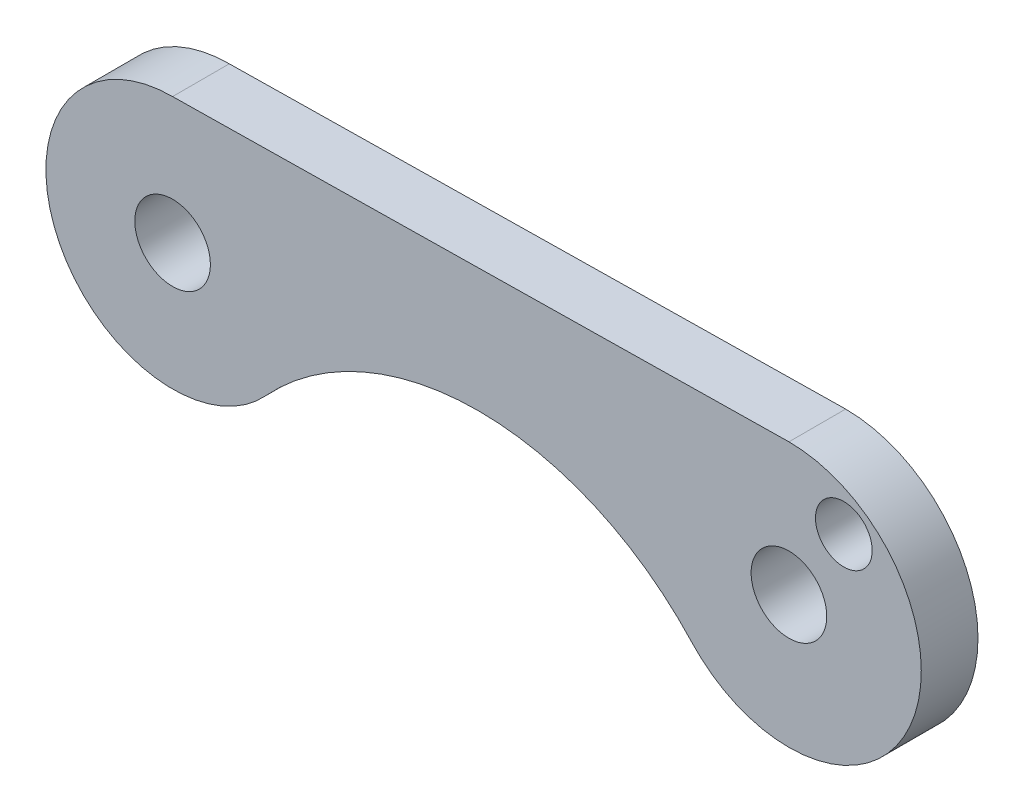
ISO-10303-21;
HEADER;
FILE_DESCRIPTION(('STEP AP214'),'2;1');
FILE_NAME('part.step','',(''),(''),'','','');
FILE_SCHEMA(('AUTOMOTIVE_DESIGN { 1 0 10303 214 1 1 1 1 }'));
ENDSEC;
DATA;
#1=APPLICATION_CONTEXT('core data for automotive mechanical design processes');
#2=APPLICATION_PROTOCOL_DEFINITION('international standard','automotive_design',2000,#1);
#3=PRODUCT_CONTEXT('',#1,'mechanical');
#4=PRODUCT('Part','Part','',(#3));
#5=PRODUCT_RELATED_PRODUCT_CATEGORY('part','',(#4));
#6=PRODUCT_DEFINITION_FORMATION('','',#4);
#7=PRODUCT_DEFINITION_CONTEXT('part definition',#1,'design');
#8=PRODUCT_DEFINITION('design','',#6,#7);
#9=PRODUCT_DEFINITION_SHAPE('','',#8);
#10=(LENGTH_UNIT() NAMED_UNIT(*) SI_UNIT(.MILLI.,.METRE.));
#11=(NAMED_UNIT(*) PLANE_ANGLE_UNIT() SI_UNIT($,.RADIAN.));
#12=(NAMED_UNIT(*) SI_UNIT($,.STERADIAN.) SOLID_ANGLE_UNIT());
#13=UNCERTAINTY_MEASURE_WITH_UNIT(LENGTH_MEASURE(1.E-05),#10,'distance_accuracy_value','');
#14=(GEOMETRIC_REPRESENTATION_CONTEXT(3) GLOBAL_UNCERTAINTY_ASSIGNED_CONTEXT((#13)) GLOBAL_UNIT_ASSIGNED_CONTEXT((#10,
#11,#12)) REPRESENTATION_CONTEXT('',''));
#15=CARTESIAN_POINT('',(0.,0.,0.));
#16=DIRECTION('',(0.,0.,1.));
#17=DIRECTION('',(1.,0.,0.));
#18=AXIS2_PLACEMENT_3D('',#15,#16,#17);
#19=CARTESIAN_POINT('',(-17.4391802539687,-14.8148116586366,3.));
#20=DIRECTION('',(0.,0.,-1.));
#21=DIRECTION('',(-1.,0.,0.));
#22=AXIS2_PLACEMENT_3D('',#19,#20,#21);
#23=CYLINDRICAL_SURFACE('',#22,15.3);
#24=CARTESIAN_POINT('',(-17.4391802539687,-14.8148116586366,0.));
#25=DIRECTION('',(0.,0.,1.));
#26=DIRECTION('',(1.,0.,0.));
#27=AXIS2_PLACEMENT_3D('',#24,#25,#26);
#28=CIRCLE('',#27,15.3);
#29=CARTESIAN_POINT('',(-6.17448324505068,-4.46123250467855,0.));
#30=VERTEX_POINT('',#29);
#31=CARTESIAN_POINT('',(-28.6926919222018,-4.44907602951017,0.));
#32=VERTEX_POINT('',#31);
#33=EDGE_CURVE('E108',#30,#32,#28,.T.);
#34=ORIENTED_EDGE('',*,*,#33,.F.);
#35=DIRECTION('',(0.,0.,-1.));
#36=VECTOR('',#35,1.);
#37=CARTESIAN_POINT('',(-6.17448324505068,-4.46123250467855,3.));
#38=LINE('',#37,#36);
#39=CARTESIAN_POINT('',(-6.17448324505068,-4.46123250467855,3.));
#40=VERTEX_POINT('',#39);
#41=EDGE_CURVE('E11',#40,#30,#38,.T.);
#42=ORIENTED_EDGE('',*,*,#41,.F.);
#43=CARTESIAN_POINT('',(-17.4391802539687,-14.8148116586366,3.));
#44=DIRECTION('',(0.,0.,1.));
#45=DIRECTION('',(1.,0.,0.));
#46=AXIS2_PLACEMENT_3D('',#43,#44,#45);
#47=CIRCLE('',#46,15.3);
#48=CARTESIAN_POINT('',(-28.6926919222018,-4.44907602951017,3.));
#49=VERTEX_POINT('',#48);
#50=EDGE_CURVE('E84',#40,#49,#47,.T.);
#51=ORIENTED_EDGE('',*,*,#50,.T.);
#52=DIRECTION('',(0.,0.,-1.));
#53=VECTOR('',#52,1.);
#54=CARTESIAN_POINT('',(-28.6926919222018,-4.44907602951017,3.));
#55=LINE('',#54,#53);
#56=EDGE_CURVE('E74',#49,#32,#55,.T.);
#57=ORIENTED_EDGE('',*,*,#56,.T.);
#58=EDGE_LOOP('',(#34,#42,#51,#57));
#59=FACE_BOUND('',#58,.T.);
#60=ADVANCED_FACE('F35',(#59),#23,.F.);
#61=CARTESIAN_POINT('',(-1.02070029979408,0.275699134387217,3.));
#62=DIRECTION('',(0.,0.,-1.));
#63=DIRECTION('',(-1.,0.,0.));
#64=AXIS2_PLACEMENT_3D('',#61,#62,#63);
#65=CYLINDRICAL_SURFACE('',#64,7.);
#66=CARTESIAN_POINT('',(-1.02070029979408,0.275699134387217,0.));
#67=DIRECTION('',(0.,0.,1.));
#68=DIRECTION('',(1.,0.,0.));
#69=AXIS2_PLACEMENT_3D('',#66,#67,#68);
#70=CIRCLE('',#69,7.);
#71=CARTESIAN_POINT('',(-1.02070029979408,7.27569913438722,0.));
#72=VERTEX_POINT('',#71);
#73=EDGE_CURVE('E90',#30,#72,#70,.T.);
#74=ORIENTED_EDGE('',*,*,#73,.T.);
#75=DIRECTION('',(0.,0.,-1.));
#76=VECTOR('',#75,1.);
#77=CARTESIAN_POINT('',(-1.02070029979408,7.27569913438722,3.));
#78=LINE('',#77,#76);
#79=CARTESIAN_POINT('',(-1.02070029979408,7.27569913438722,3.));
#80=VERTEX_POINT('',#79);
#81=EDGE_CURVE('E44',#80,#72,#78,.T.);
#82=ORIENTED_EDGE('',*,*,#81,.F.);
#83=CARTESIAN_POINT('',(-1.02070029979408,0.275699134387217,3.));
#84=DIRECTION('',(0.,0.,1.));
#85=DIRECTION('',(1.,0.,0.));
#86=AXIS2_PLACEMENT_3D('',#83,#84,#85);
#87=CIRCLE('',#86,7.);
#88=EDGE_CURVE('E79',#40,#80,#87,.T.);
#89=ORIENTED_EDGE('',*,*,#88,.F.);
#90=ORIENTED_EDGE('',*,*,#41,.T.);
#91=EDGE_LOOP('',(#74,#82,#89,#90));
#92=FACE_BOUND('',#91,.T.);
#93=ADVANCED_FACE('F88',(#92),#65,.T.);
#94=CARTESIAN_POINT('',(-0.108563703883241,7.2892841347068,3.));
#95=DIRECTION('',(-0.0148919514058761,0.999889108743227,0.));
#96=DIRECTION('',(-0.999889108743227,-0.0148919514058761,0.));
#97=AXIS2_PLACEMENT_3D('',#94,#95,#96);
#98=PLANE('',#97);
#99=DIRECTION('',(0.999889108743227,0.0148919514058761,0.));
#100=VECTOR('',#99,1.);
#101=CARTESIAN_POINT('',(-0.108563703883241,7.2892841347068,0.));
#102=LINE('',#101,#100);
#103=CARTESIAN_POINT('',(-33.6207002997941,6.79016767736218,0.));
#104=VERTEX_POINT('',#103);
#105=EDGE_CURVE('E112',#104,#72,#102,.T.);
#106=ORIENTED_EDGE('',*,*,#105,.F.);
#107=DIRECTION('',(0.,0.,-1.));
#108=VECTOR('',#107,1.);
#109=CARTESIAN_POINT('',(-33.6207002997941,6.79016767736218,3.));
#110=LINE('',#109,#108);
#111=CARTESIAN_POINT('',(-33.6207002997941,6.79016767736218,3.));
#112=VERTEX_POINT('',#111);
#113=EDGE_CURVE('E67',#112,#104,#110,.T.);
#114=ORIENTED_EDGE('',*,*,#113,.F.);
#115=DIRECTION('',(0.999889108743227,0.0148919514058761,0.));
#116=VECTOR('',#115,1.);
#117=CARTESIAN_POINT('',(-0.108563703883241,7.2892841347068,3.));
#118=LINE('',#117,#116);
#119=EDGE_CURVE('E83',#112,#80,#118,.T.);
#120=ORIENTED_EDGE('',*,*,#119,.T.);
#121=ORIENTED_EDGE('',*,*,#81,.T.);
#122=EDGE_LOOP('',(#106,#114,#120,#121));
#123=FACE_BOUND('',#122,.T.);
#124=ADVANCED_FACE('F94',(#123),#98,.T.);
#125=CARTESIAN_POINT('',(-33.6207002997941,0.0901676773621841,3.));
#126=DIRECTION('',(0.,0.,-1.));
#127=DIRECTION('',(-1.,0.,0.));
#128=AXIS2_PLACEMENT_3D('',#125,#126,#127);
#129=CYLINDRICAL_SURFACE('',#128,2.);
#130=CARTESIAN_POINT('',(-33.6207002997941,0.0901676773621841,3.));
#131=DIRECTION('',(0.,0.,1.));
#132=DIRECTION('',(1.,0.,0.));
#133=AXIS2_PLACEMENT_3D('',#130,#131,#132);
#134=CIRCLE('',#133,2.);
#135=CARTESIAN_POINT('',(-31.6207002997941,0.0901676773621841,3.));
#136=VERTEX_POINT('',#135);
#137=EDGE_CURVE('E124',#136,#136,#134,.T.);
#138=ORIENTED_EDGE('',*,*,#137,.T.);
#139=EDGE_LOOP('',(#138));
#140=FACE_BOUND('',#139,.T.);
#141=CARTESIAN_POINT('',(-33.6207002997941,0.0901676773621841,0.));
#142=DIRECTION('',(0.,0.,1.));
#143=DIRECTION('',(1.,0.,0.));
#144=AXIS2_PLACEMENT_3D('',#141,#142,#143);
#145=CIRCLE('',#144,2.);
#146=CARTESIAN_POINT('',(-31.6207002997941,0.0901676773621841,0.));
#147=VERTEX_POINT('',#146);
#148=EDGE_CURVE('E105',#147,#147,#145,.T.);
#149=ORIENTED_EDGE('',*,*,#148,.F.);
#150=EDGE_LOOP('',(#149));
#151=FACE_BOUND('',#150,.T.);
#152=ADVANCED_FACE('F136',(#140,#151),#129,.F.);
#153=CARTESIAN_POINT('',(-1.02070029979408,0.275699134387217,3.));
#154=DIRECTION('',(0.,0.,-1.));
#155=DIRECTION('',(-1.,0.,0.));
#156=AXIS2_PLACEMENT_3D('',#153,#154,#155);
#157=CYLINDRICAL_SURFACE('',#156,2.);
#158=CARTESIAN_POINT('',(-1.02070029979408,0.275699134387217,3.));
#159=DIRECTION('',(0.,0.,1.));
#160=DIRECTION('',(1.,0.,0.));
#161=AXIS2_PLACEMENT_3D('',#158,#159,#160);
#162=CIRCLE('',#161,2.);
#163=CARTESIAN_POINT('',(0.979299700205919,0.275699134387217,3.));
#164=VERTEX_POINT('',#163);
#165=EDGE_CURVE('E119',#164,#164,#162,.T.);
#166=ORIENTED_EDGE('',*,*,#165,.T.);
#167=EDGE_LOOP('',(#166));
#168=FACE_BOUND('',#167,.T.);
#169=CARTESIAN_POINT('',(-1.02070029979408,0.275699134387217,0.));
#170=DIRECTION('',(0.,0.,1.));
#171=DIRECTION('',(1.,0.,0.));
#172=AXIS2_PLACEMENT_3D('',#169,#170,#171);
#173=CIRCLE('',#172,2.);
#174=CARTESIAN_POINT('',(0.979299700205919,0.275699134387217,0.));
#175=VERTEX_POINT('',#174);
#176=EDGE_CURVE('E102',#175,#175,#173,.T.);
#177=ORIENTED_EDGE('',*,*,#176,.F.);
#178=EDGE_LOOP('',(#177));
#179=FACE_BOUND('',#178,.T.);
#180=ADVANCED_FACE('F138',(#168,#179),#157,.F.);
#181=CARTESIAN_POINT('',(1.88198628379865,4.49278347100272,3.));
#182=DIRECTION('',(0.,0.,-1.));
#183=DIRECTION('',(-1.,0.,0.));
#184=AXIS2_PLACEMENT_3D('',#181,#182,#183);
#185=CYLINDRICAL_SURFACE('',#184,1.5);
#186=CARTESIAN_POINT('',(1.88198628379865,4.49278347100272,3.));
#187=DIRECTION('',(0.,0.,1.));
#188=DIRECTION('',(1.,0.,0.));
#189=AXIS2_PLACEMENT_3D('',#186,#187,#188);
#190=CIRCLE('',#189,1.5);
#191=CARTESIAN_POINT('',(3.38198628379865,4.49278347100272,3.));
#192=VERTEX_POINT('',#191);
#193=EDGE_CURVE('E116',#192,#192,#190,.T.);
#194=ORIENTED_EDGE('',*,*,#193,.T.);
#195=EDGE_LOOP('',(#194));
#196=FACE_BOUND('',#195,.T.);
#197=CARTESIAN_POINT('',(1.88198628379865,4.49278347100272,0.));
#198=DIRECTION('',(0.,0.,1.));
#199=DIRECTION('',(1.,0.,0.));
#200=AXIS2_PLACEMENT_3D('',#197,#198,#199);
#201=CIRCLE('',#200,1.5);
#202=CARTESIAN_POINT('',(3.38198628379865,4.49278347100272,0.));
#203=VERTEX_POINT('',#202);
#204=EDGE_CURVE('E99',#203,#203,#201,.T.);
#205=ORIENTED_EDGE('',*,*,#204,.F.);
#206=EDGE_LOOP('',(#205));
#207=FACE_BOUND('',#206,.T.);
#208=ADVANCED_FACE('F37',(#196,#207),#185,.F.);
#209=CARTESIAN_POINT('',(-33.6207002997941,0.0901676773621841,3.));
#210=DIRECTION('',(0.,0.,-1.));
#211=DIRECTION('',(-1.,0.,0.));
#212=AXIS2_PLACEMENT_3D('',#209,#210,#211);
#213=CYLINDRICAL_SURFACE('',#212,6.7);
#214=CARTESIAN_POINT('',(-33.6207002997941,0.0901676773621841,0.));
#215=DIRECTION('',(0.,0.,1.));
#216=DIRECTION('',(1.,0.,0.));
#217=AXIS2_PLACEMENT_3D('',#214,#215,#216);
#218=CIRCLE('',#217,6.7);
#219=EDGE_CURVE('E114',#104,#32,#218,.T.);
#220=ORIENTED_EDGE('',*,*,#219,.T.);
#221=ORIENTED_EDGE('',*,*,#56,.F.);
#222=CARTESIAN_POINT('',(-33.6207002997941,0.0901676773621841,3.));
#223=DIRECTION('',(0.,0.,1.));
#224=DIRECTION('',(1.,0.,0.));
#225=AXIS2_PLACEMENT_3D('',#222,#223,#224);
#226=CIRCLE('',#225,6.7);
#227=EDGE_CURVE('E52',#112,#49,#226,.T.);
#228=ORIENTED_EDGE('',*,*,#227,.F.);
#229=ORIENTED_EDGE('',*,*,#113,.T.);
#230=EDGE_LOOP('',(#220,#221,#228,#229));
#231=FACE_BOUND('',#230,.T.);
#232=ADVANCED_FACE('F145',(#231),#213,.T.);
#233=CARTESIAN_POINT('',(0.,0.,3.));
#234=DIRECTION('',(0.,0.,1.));
#235=DIRECTION('',(1.,0.,0.));
#236=AXIS2_PLACEMENT_3D('',#233,#234,#235);
#237=PLANE('',#236);
#238=ORIENTED_EDGE('',*,*,#193,.F.);
#239=EDGE_LOOP('',(#238));
#240=FACE_BOUND('',#239,.T.);
#241=ORIENTED_EDGE('',*,*,#165,.F.);
#242=EDGE_LOOP('',(#241));
#243=FACE_BOUND('',#242,.T.);
#244=ORIENTED_EDGE('',*,*,#137,.F.);
#245=EDGE_LOOP('',(#244));
#246=FACE_BOUND('',#245,.T.);
#247=ORIENTED_EDGE('',*,*,#50,.F.);
#248=ORIENTED_EDGE('',*,*,#88,.T.);
#249=ORIENTED_EDGE('',*,*,#119,.F.);
#250=ORIENTED_EDGE('',*,*,#227,.T.);
#251=EDGE_LOOP('',(#247,#248,#249,#250));
#252=FACE_BOUND('',#251,.T.);
#253=ADVANCED_FACE('F81',(#240,#243,#246,#252),#237,.T.);
#254=CARTESIAN_POINT('',(0.,0.,0.));
#255=DIRECTION('',(0.,0.,1.));
#256=DIRECTION('',(1.,0.,0.));
#257=AXIS2_PLACEMENT_3D('',#254,#255,#256);
#258=PLANE('',#257);
#259=ORIENTED_EDGE('',*,*,#204,.T.);
#260=EDGE_LOOP('',(#259));
#261=FACE_BOUND('',#260,.T.);
#262=ORIENTED_EDGE('',*,*,#176,.T.);
#263=EDGE_LOOP('',(#262));
#264=FACE_BOUND('',#263,.T.);
#265=ORIENTED_EDGE('',*,*,#148,.T.);
#266=EDGE_LOOP('',(#265));
#267=FACE_BOUND('',#266,.T.);
#268=ORIENTED_EDGE('',*,*,#33,.T.);
#269=ORIENTED_EDGE('',*,*,#219,.F.);
#270=ORIENTED_EDGE('',*,*,#105,.T.);
#271=ORIENTED_EDGE('',*,*,#73,.F.);
#272=EDGE_LOOP('',(#268,#269,#270,#271));
#273=FACE_BOUND('',#272,.T.);
#274=ADVANCED_FACE('F150',(#261,#264,#267,#273),#258,.F.);
#275=CLOSED_SHELL('',(#60,#93,#124,#152,#180,#208,#232,#253,#274));
#276=MANIFOLD_SOLID_BREP('B2',#275);
#277=ADVANCED_BREP_SHAPE_REPRESENTATION('',(#18,#276),#14);
#278=SHAPE_DEFINITION_REPRESENTATION(#9,#277);
ENDSEC;
END-ISO-10303-21;
